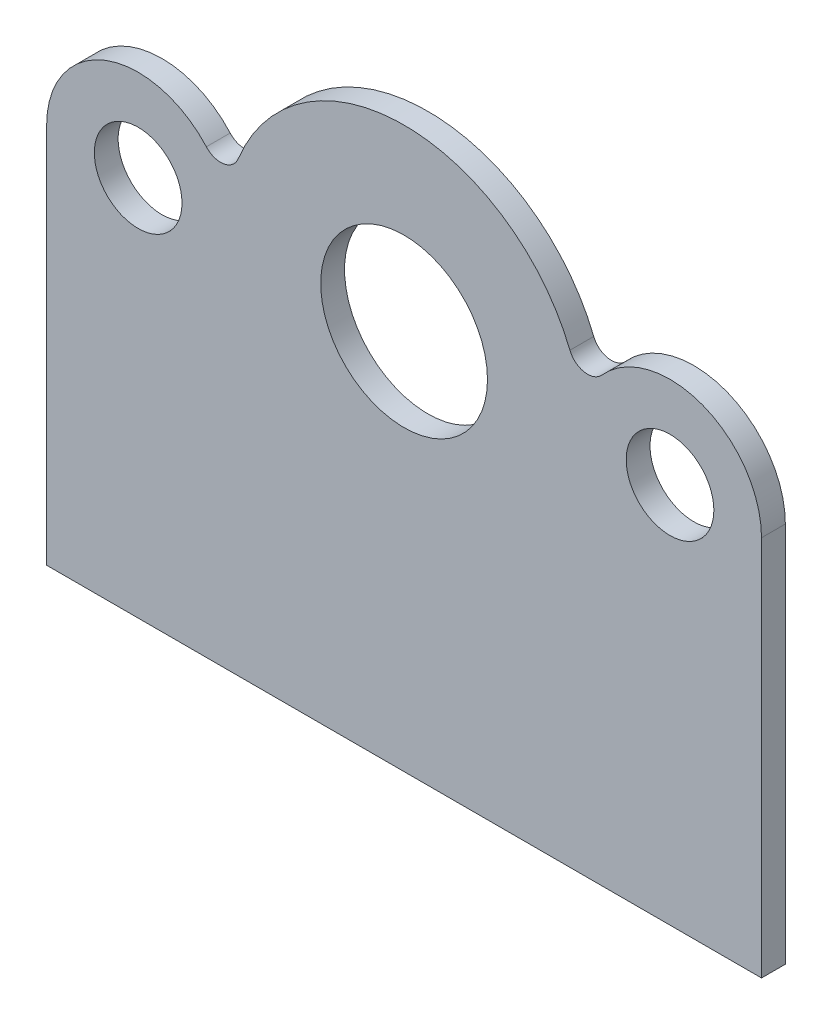
ISO-10303-21;
HEADER;
FILE_DESCRIPTION(('STEP AP214'),'2;1');
FILE_NAME('part.step','',(''),(''),'','','');
FILE_SCHEMA(('AUTOMOTIVE_DESIGN { 1 0 10303 214 1 1 1 1 }'));
ENDSEC;
DATA;
#1=APPLICATION_CONTEXT('core data for automotive mechanical design processes');
#2=APPLICATION_PROTOCOL_DEFINITION('international standard','automotive_design',2000,#1);
#3=PRODUCT_CONTEXT('',#1,'mechanical');
#4=PRODUCT('Part','Part','',(#3));
#5=PRODUCT_RELATED_PRODUCT_CATEGORY('part','',(#4));
#6=PRODUCT_DEFINITION_FORMATION('','',#4);
#7=PRODUCT_DEFINITION_CONTEXT('part definition',#1,'design');
#8=PRODUCT_DEFINITION('design','',#6,#7);
#9=PRODUCT_DEFINITION_SHAPE('','',#8);
#10=(LENGTH_UNIT() NAMED_UNIT(*) SI_UNIT(.MILLI.,.METRE.));
#11=(NAMED_UNIT(*) PLANE_ANGLE_UNIT() SI_UNIT($,.RADIAN.));
#12=(NAMED_UNIT(*) SI_UNIT($,.STERADIAN.) SOLID_ANGLE_UNIT());
#13=UNCERTAINTY_MEASURE_WITH_UNIT(LENGTH_MEASURE(1.E-05),#10,'distance_accuracy_value','');
#14=(GEOMETRIC_REPRESENTATION_CONTEXT(3) GLOBAL_UNCERTAINTY_ASSIGNED_CONTEXT((#13)) GLOBAL_UNIT_ASSIGNED_CONTEXT((#10,
#11,#12)) REPRESENTATION_CONTEXT('',''));
#15=CARTESIAN_POINT('',(0.,0.,0.));
#16=DIRECTION('',(0.,0.,1.));
#17=DIRECTION('',(1.,0.,0.));
#18=AXIS2_PLACEMENT_3D('',#15,#16,#17);
#19=CARTESIAN_POINT('',(6.096,25.4,1.5875));
#20=DIRECTION('',(0.,0.,1.));
#21=DIRECTION('',(1.,0.,0.));
#22=AXIS2_PLACEMENT_3D('',#19,#20,#21);
#23=PLANE('',#22);
#24=CARTESIAN_POINT('',(6.096,25.4,1.5875));
#25=DIRECTION('',(0.,0.,1.));
#26=DIRECTION('',(1.,0.,0.));
#27=AXIS2_PLACEMENT_3D('',#24,#25,#26);
#28=CIRCLE('',#27,2.921);
#29=CARTESIAN_POINT('',(9.017,25.4,1.5875));
#30=VERTEX_POINT('',#29);
#31=EDGE_CURVE('E183',#30,#30,#28,.T.);
#32=ORIENTED_EDGE('',*,*,#31,.F.);
#33=EDGE_LOOP('',(#32));
#34=FACE_BOUND('',#33,.T.);
#35=DIRECTION('',(0.,-1.,0.));
#36=VECTOR('',#35,1.);
#37=CARTESIAN_POINT('',(0.,0.,1.5875));
#38=LINE('',#37,#36);
#39=CARTESIAN_POINT('',(0.,25.4,1.5875));
#40=VERTEX_POINT('',#39);
#41=CARTESIAN_POINT('',(0.,0.,1.5875));
#42=VERTEX_POINT('',#41);
#43=EDGE_CURVE('E146',#40,#42,#38,.T.);
#44=ORIENTED_EDGE('',*,*,#43,.T.);
#45=DIRECTION('',(1.,0.,0.));
#46=VECTOR('',#45,1.);
#47=CARTESIAN_POINT('',(0.,0.,1.5875));
#48=LINE('',#47,#46);
#49=CARTESIAN_POINT('',(47.625,0.,1.5875));
#50=VERTEX_POINT('',#49);
#51=EDGE_CURVE('E94',#42,#50,#48,.T.);
#52=ORIENTED_EDGE('',*,*,#51,.T.);
#53=DIRECTION('',(0.,1.,0.));
#54=VECTOR('',#53,1.);
#55=CARTESIAN_POINT('',(47.625,0.,1.5875));
#56=LINE('',#55,#54);
#57=CARTESIAN_POINT('',(47.625,25.4,1.5875));
#58=VERTEX_POINT('',#57);
#59=EDGE_CURVE('E161',#50,#58,#56,.T.);
#60=ORIENTED_EDGE('',*,*,#59,.T.);
#61=CARTESIAN_POINT('',(41.529,25.4,1.5875));
#62=DIRECTION('',(0.,0.,1.));
#63=DIRECTION('',(1.,0.,0.));
#64=AXIS2_PLACEMENT_3D('',#61,#62,#63);
#65=CIRCLE('',#64,6.096);
#66=CARTESIAN_POINT('',(36.9857480533927,29.4644898510943,1.5875));
#67=VERTEX_POINT('',#66);
#68=EDGE_CURVE('E174',#58,#67,#65,.T.);
#69=ORIENTED_EDGE('',*,*,#68,.T.);
#70=CARTESIAN_POINT('',(36.0392372311828,30.3112585700723,1.5875));
#71=DIRECTION('',(0.,0.,-1.));
#72=DIRECTION('',(1.,0.,0.));
#73=AXIS2_PLACEMENT_3D('',#70,#71,#72);
#74=CIRCLE('',#73,1.27);
#75=CARTESIAN_POINT('',(34.8607565342013,29.8378842500653,1.5875));
#76=VERTEX_POINT('',#75);
#77=EDGE_CURVE('E113',#67,#76,#74,.T.);
#78=ORIENTED_EDGE('',*,*,#77,.T.);
#79=CARTESIAN_POINT('',(23.8125,25.4,1.5875));
#80=DIRECTION('',(0.,0.,1.));
#81=DIRECTION('',(1.,0.,0.));
#82=AXIS2_PLACEMENT_3D('',#79,#80,#81);
#83=CIRCLE('',#82,11.90625);
#84=CARTESIAN_POINT('',(12.7642434657987,29.8378842500653,1.5875));
#85=VERTEX_POINT('',#84);
#86=EDGE_CURVE('E107',#76,#85,#83,.T.);
#87=ORIENTED_EDGE('',*,*,#86,.T.);
#88=CARTESIAN_POINT('',(11.5857627688172,30.3112585700723,1.5875));
#89=DIRECTION('',(0.,0.,-1.));
#90=DIRECTION('',(1.,0.,0.));
#91=AXIS2_PLACEMENT_3D('',#88,#89,#90);
#92=CIRCLE('',#91,1.27);
#93=CARTESIAN_POINT('',(10.6392519466073,29.4644898510943,1.5875));
#94=VERTEX_POINT('',#93);
#95=EDGE_CURVE('E111',#85,#94,#92,.T.);
#96=ORIENTED_EDGE('',*,*,#95,.T.);
#97=CARTESIAN_POINT('',(6.096,25.4,1.5875));
#98=DIRECTION('',(0.,0.,1.));
#99=DIRECTION('',(1.,0.,0.));
#100=AXIS2_PLACEMENT_3D('',#97,#98,#99);
#101=CIRCLE('',#100,6.096);
#102=EDGE_CURVE('E51',#94,#40,#101,.T.);
#103=ORIENTED_EDGE('',*,*,#102,.T.);
#104=EDGE_LOOP('',(#44,#52,#60,#69,#78,#87,#96,#103));
#105=FACE_BOUND('',#104,.T.);
#106=CARTESIAN_POINT('',(23.8125,25.4,1.5875));
#107=DIRECTION('',(0.,0.,1.));
#108=DIRECTION('',(1.,0.,0.));
#109=AXIS2_PLACEMENT_3D('',#106,#107,#108);
#110=CIRCLE('',#109,5.55625);
#111=CARTESIAN_POINT('',(29.36875,25.4,1.5875));
#112=VERTEX_POINT('',#111);
#113=EDGE_CURVE('E135',#112,#112,#110,.T.);
#114=ORIENTED_EDGE('',*,*,#113,.F.);
#115=EDGE_LOOP('',(#114));
#116=FACE_BOUND('',#115,.T.);
#117=CARTESIAN_POINT('',(41.529,25.4,1.5875));
#118=DIRECTION('',(0.,0.,1.));
#119=DIRECTION('',(1.,0.,0.));
#120=AXIS2_PLACEMENT_3D('',#117,#118,#119);
#121=CIRCLE('',#120,2.921);
#122=CARTESIAN_POINT('',(44.45,25.4,1.5875));
#123=VERTEX_POINT('',#122);
#124=EDGE_CURVE('E189',#123,#123,#121,.T.);
#125=ORIENTED_EDGE('',*,*,#124,.F.);
#126=EDGE_LOOP('',(#125));
#127=FACE_BOUND('',#126,.T.);
#128=ADVANCED_FACE('F34',(#34,#105,#116,#127),#23,.T.);
#129=CARTESIAN_POINT('',(6.096,25.4,0.));
#130=DIRECTION('',(0.,0.,1.));
#131=DIRECTION('',(1.,0.,0.));
#132=AXIS2_PLACEMENT_3D('',#129,#130,#131);
#133=PLANE('',#132);
#134=DIRECTION('',(0.,-1.,0.));
#135=VECTOR('',#134,1.);
#136=CARTESIAN_POINT('',(0.,0.,0.));
#137=LINE('',#136,#135);
#138=CARTESIAN_POINT('',(0.,25.4,0.));
#139=VERTEX_POINT('',#138);
#140=CARTESIAN_POINT('',(0.,0.,0.));
#141=VERTEX_POINT('',#140);
#142=EDGE_CURVE('E131',#139,#141,#137,.T.);
#143=ORIENTED_EDGE('',*,*,#142,.F.);
#144=CARTESIAN_POINT('',(6.096,25.4,0.));
#145=DIRECTION('',(0.,0.,1.));
#146=DIRECTION('',(1.,0.,0.));
#147=AXIS2_PLACEMENT_3D('',#144,#145,#146);
#148=CIRCLE('',#147,6.096);
#149=CARTESIAN_POINT('',(10.6392519466073,29.4644898510943,0.));
#150=VERTEX_POINT('',#149);
#151=EDGE_CURVE('E86',#150,#139,#148,.T.);
#152=ORIENTED_EDGE('',*,*,#151,.F.);
#153=CARTESIAN_POINT('',(11.5857627688172,30.3112585700723,0.));
#154=DIRECTION('',(0.,0.,-1.));
#155=DIRECTION('',(1.,0.,0.));
#156=AXIS2_PLACEMENT_3D('',#153,#154,#155);
#157=CIRCLE('',#156,1.27);
#158=CARTESIAN_POINT('',(12.7642434657987,29.8378842500653,0.));
#159=VERTEX_POINT('',#158);
#160=EDGE_CURVE('E80',#159,#150,#157,.T.);
#161=ORIENTED_EDGE('',*,*,#160,.F.);
#162=CARTESIAN_POINT('',(23.8125,25.4,0.));
#163=DIRECTION('',(0.,0.,1.));
#164=DIRECTION('',(1.,0.,0.));
#165=AXIS2_PLACEMENT_3D('',#162,#163,#164);
#166=CIRCLE('',#165,11.90625);
#167=CARTESIAN_POINT('',(34.8607565342013,29.8378842500653,0.));
#168=VERTEX_POINT('',#167);
#169=EDGE_CURVE('E121',#168,#159,#166,.T.);
#170=ORIENTED_EDGE('',*,*,#169,.F.);
#171=CARTESIAN_POINT('',(36.0392372311828,30.3112585700723,0.));
#172=DIRECTION('',(0.,0.,-1.));
#173=DIRECTION('',(1.,0.,0.));
#174=AXIS2_PLACEMENT_3D('',#171,#172,#173);
#175=CIRCLE('',#174,1.27);
#176=CARTESIAN_POINT('',(36.9857480533927,29.4644898510943,0.));
#177=VERTEX_POINT('',#176);
#178=EDGE_CURVE('E141',#177,#168,#175,.T.);
#179=ORIENTED_EDGE('',*,*,#178,.F.);
#180=CARTESIAN_POINT('',(41.529,25.4,0.));
#181=DIRECTION('',(0.,0.,1.));
#182=DIRECTION('',(1.,0.,0.));
#183=AXIS2_PLACEMENT_3D('',#180,#181,#182);
#184=CIRCLE('',#183,6.096);
#185=CARTESIAN_POINT('',(47.625,25.4,0.));
#186=VERTEX_POINT('',#185);
#187=EDGE_CURVE('E139',#186,#177,#184,.T.);
#188=ORIENTED_EDGE('',*,*,#187,.F.);
#189=DIRECTION('',(0.,1.,0.));
#190=VECTOR('',#189,1.);
#191=CARTESIAN_POINT('',(47.625,0.,0.));
#192=LINE('',#191,#190);
#193=CARTESIAN_POINT('',(47.625,0.,0.));
#194=VERTEX_POINT('',#193);
#195=EDGE_CURVE('E137',#194,#186,#192,.T.);
#196=ORIENTED_EDGE('',*,*,#195,.F.);
#197=DIRECTION('',(1.,0.,0.));
#198=VECTOR('',#197,1.);
#199=CARTESIAN_POINT('',(0.,0.,0.));
#200=LINE('',#199,#198);
#201=EDGE_CURVE('E134',#141,#194,#200,.T.);
#202=ORIENTED_EDGE('',*,*,#201,.F.);
#203=EDGE_LOOP('',(#143,#152,#161,#170,#179,#188,#196,#202));
#204=FACE_BOUND('',#203,.T.);
#205=CARTESIAN_POINT('',(23.8125,25.4,0.));
#206=DIRECTION('',(0.,0.,1.));
#207=DIRECTION('',(1.,0.,0.));
#208=AXIS2_PLACEMENT_3D('',#205,#206,#207);
#209=CIRCLE('',#208,5.55625);
#210=CARTESIAN_POINT('',(29.36875,25.4,0.));
#211=VERTEX_POINT('',#210);
#212=EDGE_CURVE('E180',#211,#211,#209,.T.);
#213=ORIENTED_EDGE('',*,*,#212,.T.);
#214=EDGE_LOOP('',(#213));
#215=FACE_BOUND('',#214,.T.);
#216=CARTESIAN_POINT('',(6.096,25.4,0.));
#217=DIRECTION('',(0.,0.,1.));
#218=DIRECTION('',(1.,0.,0.));
#219=AXIS2_PLACEMENT_3D('',#216,#217,#218);
#220=CIRCLE('',#219,2.921);
#221=CARTESIAN_POINT('',(9.017,25.4,0.));
#222=VERTEX_POINT('',#221);
#223=EDGE_CURVE('E186',#222,#222,#220,.T.);
#224=ORIENTED_EDGE('',*,*,#223,.T.);
#225=EDGE_LOOP('',(#224));
#226=FACE_BOUND('',#225,.T.);
#227=CARTESIAN_POINT('',(41.529,25.4,0.));
#228=DIRECTION('',(0.,0.,1.));
#229=DIRECTION('',(1.,0.,0.));
#230=AXIS2_PLACEMENT_3D('',#227,#228,#229);
#231=CIRCLE('',#230,2.921);
#232=CARTESIAN_POINT('',(44.45,25.4,0.));
#233=VERTEX_POINT('',#232);
#234=EDGE_CURVE('E192',#233,#233,#231,.T.);
#235=ORIENTED_EDGE('',*,*,#234,.T.);
#236=EDGE_LOOP('',(#235));
#237=FACE_BOUND('',#236,.T.);
#238=ADVANCED_FACE('F165',(#204,#215,#226,#237),#133,.F.);
#239=CARTESIAN_POINT('',(0.,0.,1.5875));
#240=DIRECTION('',(1.,0.,0.));
#241=DIRECTION('',(0.,0.,-1.));
#242=AXIS2_PLACEMENT_3D('',#239,#240,#241);
#243=PLANE('',#242);
#244=ORIENTED_EDGE('',*,*,#142,.T.);
#245=DIRECTION('',(0.,0.,-1.));
#246=VECTOR('',#245,1.);
#247=CARTESIAN_POINT('',(0.,0.,1.5875));
#248=LINE('',#247,#246);
#249=EDGE_CURVE('E11',#42,#141,#248,.T.);
#250=ORIENTED_EDGE('',*,*,#249,.F.);
#251=ORIENTED_EDGE('',*,*,#43,.F.);
#252=DIRECTION('',(0.,0.,-1.));
#253=VECTOR('',#252,1.);
#254=CARTESIAN_POINT('',(0.,25.4,1.5875));
#255=LINE('',#254,#253);
#256=EDGE_CURVE('E127',#40,#139,#255,.T.);
#257=ORIENTED_EDGE('',*,*,#256,.T.);
#258=EDGE_LOOP('',(#244,#250,#251,#257));
#259=FACE_BOUND('',#258,.T.);
#260=ADVANCED_FACE('F36',(#259),#243,.F.);
#261=CARTESIAN_POINT('',(0.,0.,1.5875));
#262=DIRECTION('',(0.,1.,0.));
#263=DIRECTION('',(0.,0.,1.));
#264=AXIS2_PLACEMENT_3D('',#261,#262,#263);
#265=PLANE('',#264);
#266=ORIENTED_EDGE('',*,*,#201,.T.);
#267=DIRECTION('',(0.,0.,-1.));
#268=VECTOR('',#267,1.);
#269=CARTESIAN_POINT('',(47.625,0.,1.5875));
#270=LINE('',#269,#268);
#271=EDGE_CURVE('E43',#50,#194,#270,.T.);
#272=ORIENTED_EDGE('',*,*,#271,.F.);
#273=ORIENTED_EDGE('',*,*,#51,.F.);
#274=ORIENTED_EDGE('',*,*,#249,.T.);
#275=EDGE_LOOP('',(#266,#272,#273,#274));
#276=FACE_BOUND('',#275,.T.);
#277=ADVANCED_FACE('F225',(#276),#265,.F.);
#278=CARTESIAN_POINT('',(47.625,0.,1.5875));
#279=DIRECTION('',(-1.,0.,0.));
#280=DIRECTION('',(0.,0.,1.));
#281=AXIS2_PLACEMENT_3D('',#278,#279,#280);
#282=PLANE('',#281);
#283=ORIENTED_EDGE('',*,*,#195,.T.);
#284=DIRECTION('',(0.,0.,-1.));
#285=VECTOR('',#284,1.);
#286=CARTESIAN_POINT('',(47.625,25.4,1.5875));
#287=LINE('',#286,#285);
#288=EDGE_CURVE('E153',#58,#186,#287,.T.);
#289=ORIENTED_EDGE('',*,*,#288,.F.);
#290=ORIENTED_EDGE('',*,*,#59,.F.);
#291=ORIENTED_EDGE('',*,*,#271,.T.);
#292=EDGE_LOOP('',(#283,#289,#290,#291));
#293=FACE_BOUND('',#292,.T.);
#294=ADVANCED_FACE('F159',(#293),#282,.F.);
#295=CARTESIAN_POINT('',(41.529,25.4,1.5875));
#296=DIRECTION('',(0.,0.,-1.));
#297=DIRECTION('',(-1.,0.,0.));
#298=AXIS2_PLACEMENT_3D('',#295,#296,#297);
#299=CYLINDRICAL_SURFACE('',#298,6.096);
#300=ORIENTED_EDGE('',*,*,#187,.T.);
#301=DIRECTION('',(0.,0.,-1.));
#302=VECTOR('',#301,1.);
#303=CARTESIAN_POINT('',(36.9857480533927,29.4644898510943,1.5875));
#304=LINE('',#303,#302);
#305=EDGE_CURVE('E150',#67,#177,#304,.T.);
#306=ORIENTED_EDGE('',*,*,#305,.F.);
#307=ORIENTED_EDGE('',*,*,#68,.F.);
#308=ORIENTED_EDGE('',*,*,#288,.T.);
#309=EDGE_LOOP('',(#300,#306,#307,#308));
#310=FACE_BOUND('',#309,.T.);
#311=ADVANCED_FACE('F170',(#310),#299,.T.);
#312=CARTESIAN_POINT('',(36.0392372311828,30.3112585700723,1.5875));
#313=DIRECTION('',(0.,0.,-1.));
#314=DIRECTION('',(-1.,0.,0.));
#315=AXIS2_PLACEMENT_3D('',#312,#313,#314);
#316=CYLINDRICAL_SURFACE('',#315,1.27);
#317=ORIENTED_EDGE('',*,*,#178,.T.);
#318=DIRECTION('',(0.,0.,-1.));
#319=VECTOR('',#318,1.);
#320=CARTESIAN_POINT('',(34.8607565342013,29.8378842500653,1.5875));
#321=LINE('',#320,#319);
#322=EDGE_CURVE('E122',#76,#168,#321,.T.);
#323=ORIENTED_EDGE('',*,*,#322,.F.);
#324=ORIENTED_EDGE('',*,*,#77,.F.);
#325=ORIENTED_EDGE('',*,*,#305,.T.);
#326=EDGE_LOOP('',(#317,#323,#324,#325));
#327=FACE_BOUND('',#326,.T.);
#328=ADVANCED_FACE('F173',(#327),#316,.F.);
#329=CARTESIAN_POINT('',(23.8125,25.4,1.5875));
#330=DIRECTION('',(0.,0.,-1.));
#331=DIRECTION('',(-1.,0.,0.));
#332=AXIS2_PLACEMENT_3D('',#329,#330,#331);
#333=CYLINDRICAL_SURFACE('',#332,11.90625);
#334=ORIENTED_EDGE('',*,*,#169,.T.);
#335=DIRECTION('',(0.,0.,-1.));
#336=VECTOR('',#335,1.);
#337=CARTESIAN_POINT('',(12.7642434657987,29.8378842500653,1.5875));
#338=LINE('',#337,#336);
#339=EDGE_CURVE('E118',#85,#159,#338,.T.);
#340=ORIENTED_EDGE('',*,*,#339,.F.);
#341=ORIENTED_EDGE('',*,*,#86,.F.);
#342=ORIENTED_EDGE('',*,*,#322,.T.);
#343=EDGE_LOOP('',(#334,#340,#341,#342));
#344=FACE_BOUND('',#343,.T.);
#345=ADVANCED_FACE('F119',(#344),#333,.T.);
#346=CARTESIAN_POINT('',(11.5857627688172,30.3112585700723,1.5875));
#347=DIRECTION('',(0.,0.,-1.));
#348=DIRECTION('',(-1.,0.,0.));
#349=AXIS2_PLACEMENT_3D('',#346,#347,#348);
#350=CYLINDRICAL_SURFACE('',#349,1.27);
#351=ORIENTED_EDGE('',*,*,#160,.T.);
#352=DIRECTION('',(0.,0.,-1.));
#353=VECTOR('',#352,1.);
#354=CARTESIAN_POINT('',(10.6392519466073,29.4644898510943,1.5875));
#355=LINE('',#354,#353);
#356=EDGE_CURVE('E123',#94,#150,#355,.T.);
#357=ORIENTED_EDGE('',*,*,#356,.F.);
#358=ORIENTED_EDGE('',*,*,#95,.F.);
#359=ORIENTED_EDGE('',*,*,#339,.T.);
#360=EDGE_LOOP('',(#351,#357,#358,#359));
#361=FACE_BOUND('',#360,.T.);
#362=ADVANCED_FACE('F125',(#361),#350,.F.);
#363=CARTESIAN_POINT('',(6.096,25.4,1.5875));
#364=DIRECTION('',(0.,0.,-1.));
#365=DIRECTION('',(-1.,0.,0.));
#366=AXIS2_PLACEMENT_3D('',#363,#364,#365);
#367=CYLINDRICAL_SURFACE('',#366,6.096);
#368=ORIENTED_EDGE('',*,*,#151,.T.);
#369=ORIENTED_EDGE('',*,*,#256,.F.);
#370=ORIENTED_EDGE('',*,*,#102,.F.);
#371=ORIENTED_EDGE('',*,*,#356,.T.);
#372=EDGE_LOOP('',(#368,#369,#370,#371));
#373=FACE_BOUND('',#372,.T.);
#374=ADVANCED_FACE('F213',(#373),#367,.T.);
#375=CARTESIAN_POINT('',(23.8125,25.4,1.5875));
#376=DIRECTION('',(0.,0.,-1.));
#377=DIRECTION('',(-1.,0.,0.));
#378=AXIS2_PLACEMENT_3D('',#375,#376,#377);
#379=CYLINDRICAL_SURFACE('',#378,5.55625);
#380=ORIENTED_EDGE('',*,*,#113,.T.);
#381=EDGE_LOOP('',(#380));
#382=FACE_BOUND('',#381,.T.);
#383=ORIENTED_EDGE('',*,*,#212,.F.);
#384=EDGE_LOOP('',(#383));
#385=FACE_BOUND('',#384,.T.);
#386=ADVANCED_FACE('F210',(#382,#385),#379,.F.);
#387=CARTESIAN_POINT('',(6.096,25.4,1.5875));
#388=DIRECTION('',(0.,0.,-1.));
#389=DIRECTION('',(-1.,0.,0.));
#390=AXIS2_PLACEMENT_3D('',#387,#388,#389);
#391=CYLINDRICAL_SURFACE('',#390,2.921);
#392=ORIENTED_EDGE('',*,*,#31,.T.);
#393=EDGE_LOOP('',(#392));
#394=FACE_BOUND('',#393,.T.);
#395=ORIENTED_EDGE('',*,*,#223,.F.);
#396=EDGE_LOOP('',(#395));
#397=FACE_BOUND('',#396,.T.);
#398=ADVANCED_FACE('F289',(#394,#397),#391,.F.);
#399=CARTESIAN_POINT('',(41.529,25.4,1.5875));
#400=DIRECTION('',(0.,0.,-1.));
#401=DIRECTION('',(-1.,0.,0.));
#402=AXIS2_PLACEMENT_3D('',#399,#400,#401);
#403=CYLINDRICAL_SURFACE('',#402,2.921);
#404=ORIENTED_EDGE('',*,*,#124,.T.);
#405=EDGE_LOOP('',(#404));
#406=FACE_BOUND('',#405,.T.);
#407=ORIENTED_EDGE('',*,*,#234,.F.);
#408=EDGE_LOOP('',(#407));
#409=FACE_BOUND('',#408,.T.);
#410=ADVANCED_FACE('F198',(#406,#409),#403,.F.);
#411=CLOSED_SHELL('',(#128,#238,#260,#277,#294,#311,#328,#345,#362,#374,#386,#398,#410));
#412=MANIFOLD_SOLID_BREP('B2',#411);
#413=ADVANCED_BREP_SHAPE_REPRESENTATION('',(#18,#412),#14);
#414=SHAPE_DEFINITION_REPRESENTATION(#9,#413);
ENDSEC;
END-ISO-10303-21;
